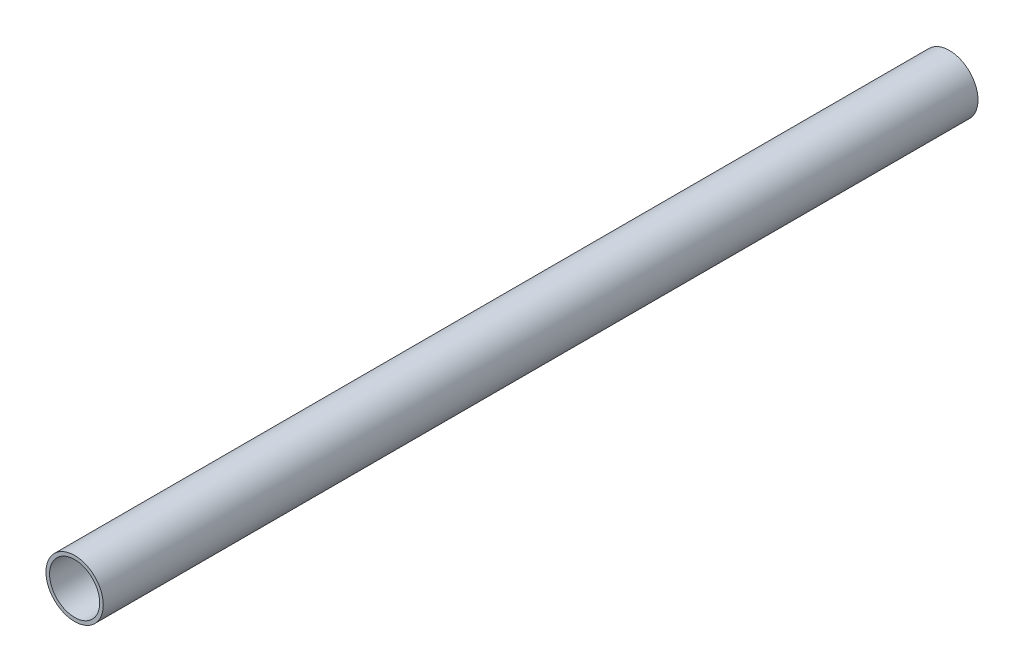
ISO-10303-21;
HEADER;
FILE_DESCRIPTION(('STEP AP214'),'2;1');
FILE_NAME('part.step','',(''),(''),'','','');
FILE_SCHEMA(('AUTOMOTIVE_DESIGN { 1 0 10303 214 1 1 1 1 }'));
ENDSEC;
DATA;
#1=APPLICATION_CONTEXT('core data for automotive mechanical design processes');
#2=APPLICATION_PROTOCOL_DEFINITION('international standard','automotive_design',2000,#1);
#3=PRODUCT_CONTEXT('',#1,'mechanical');
#4=PRODUCT('Part','Part','',(#3));
#5=PRODUCT_RELATED_PRODUCT_CATEGORY('part','',(#4));
#6=PRODUCT_DEFINITION_FORMATION('','',#4);
#7=PRODUCT_DEFINITION_CONTEXT('part definition',#1,'design');
#8=PRODUCT_DEFINITION('design','',#6,#7);
#9=PRODUCT_DEFINITION_SHAPE('','',#8);
#10=(LENGTH_UNIT() NAMED_UNIT(*) SI_UNIT(.MILLI.,.METRE.));
#11=(NAMED_UNIT(*) PLANE_ANGLE_UNIT() SI_UNIT($,.RADIAN.));
#12=(NAMED_UNIT(*) SI_UNIT($,.STERADIAN.) SOLID_ANGLE_UNIT());
#13=UNCERTAINTY_MEASURE_WITH_UNIT(LENGTH_MEASURE(1.E-05),#10,'distance_accuracy_value','');
#14=(GEOMETRIC_REPRESENTATION_CONTEXT(3) GLOBAL_UNCERTAINTY_ASSIGNED_CONTEXT((#13)) GLOBAL_UNIT_ASSIGNED_CONTEXT((#10,
#11,#12)) REPRESENTATION_CONTEXT('',''));
#15=CARTESIAN_POINT('',(0.,0.,0.));
#16=DIRECTION('',(0.,0.,1.));
#17=DIRECTION('',(1.,0.,0.));
#18=AXIS2_PLACEMENT_3D('',#15,#16,#17);
#19=CARTESIAN_POINT('',(0.,0.,387.62));
#20=DIRECTION('',(0.,0.,1.));
#21=DIRECTION('',(1.,0.,0.));
#22=AXIS2_PLACEMENT_3D('',#19,#20,#21);
#23=PLANE('',#22);
#24=CARTESIAN_POINT('',(0.,0.,387.62));
#25=DIRECTION('',(0.,0.,1.));
#26=DIRECTION('',(1.,0.,0.));
#27=AXIS2_PLACEMENT_3D('',#24,#25,#26);
#28=CIRCLE('',#27,12.7);
#29=CARTESIAN_POINT('',(12.7,0.,387.62));
#30=VERTEX_POINT('',#29);
#31=EDGE_CURVE('E10',#30,#30,#28,.T.);
#32=ORIENTED_EDGE('',*,*,#31,.T.);
#33=EDGE_LOOP('',(#32));
#34=FACE_BOUND('',#33,.T.);
#35=CARTESIAN_POINT('',(0.,0.,387.62));
#36=DIRECTION('',(0.,0.,1.));
#37=DIRECTION('',(1.,0.,0.));
#38=AXIS2_PLACEMENT_3D('',#35,#36,#37);
#39=CIRCLE('',#38,11.1125);
#40=CARTESIAN_POINT('',(11.1125,0.,387.62));
#41=VERTEX_POINT('',#40);
#42=EDGE_CURVE('E44',#41,#41,#39,.T.);
#43=ORIENTED_EDGE('',*,*,#42,.F.);
#44=EDGE_LOOP('',(#43));
#45=FACE_BOUND('',#44,.T.);
#46=ADVANCED_FACE('F33',(#34,#45),#23,.T.);
#47=CARTESIAN_POINT('',(0.,0.,0.));
#48=DIRECTION('',(0.,0.,1.));
#49=DIRECTION('',(1.,0.,0.));
#50=AXIS2_PLACEMENT_3D('',#47,#48,#49);
#51=PLANE('',#50);
#52=CARTESIAN_POINT('',(0.,0.,0.));
#53=DIRECTION('',(0.,0.,1.));
#54=DIRECTION('',(1.,0.,0.));
#55=AXIS2_PLACEMENT_3D('',#52,#53,#54);
#56=CIRCLE('',#55,12.7);
#57=CARTESIAN_POINT('',(12.7,0.,0.));
#58=VERTEX_POINT('',#57);
#59=EDGE_CURVE('E37',#58,#58,#56,.T.);
#60=ORIENTED_EDGE('',*,*,#59,.F.);
#61=EDGE_LOOP('',(#60));
#62=FACE_BOUND('',#61,.T.);
#63=CARTESIAN_POINT('',(0.,0.,0.));
#64=DIRECTION('',(0.,0.,1.));
#65=DIRECTION('',(1.,0.,0.));
#66=AXIS2_PLACEMENT_3D('',#63,#64,#65);
#67=CIRCLE('',#66,11.1125);
#68=CARTESIAN_POINT('',(11.1125,0.,0.));
#69=VERTEX_POINT('',#68);
#70=EDGE_CURVE('E46',#69,#69,#67,.T.);
#71=ORIENTED_EDGE('',*,*,#70,.T.);
#72=EDGE_LOOP('',(#71));
#73=FACE_BOUND('',#72,.T.);
#74=ADVANCED_FACE('F56',(#62,#73),#51,.F.);
#75=CARTESIAN_POINT('',(0.,0.,387.62));
#76=DIRECTION('',(0.,0.,-1.));
#77=DIRECTION('',(-1.,0.,0.));
#78=AXIS2_PLACEMENT_3D('',#75,#76,#77);
#79=CYLINDRICAL_SURFACE('',#78,12.7);
#80=ORIENTED_EDGE('',*,*,#31,.F.);
#81=EDGE_LOOP('',(#80));
#82=FACE_BOUND('',#81,.T.);
#83=ORIENTED_EDGE('',*,*,#59,.T.);
#84=EDGE_LOOP('',(#83));
#85=FACE_BOUND('',#84,.T.);
#86=ADVANCED_FACE('F35',(#82,#85),#79,.T.);
#87=CARTESIAN_POINT('',(0.,0.,387.62));
#88=DIRECTION('',(0.,0.,-1.));
#89=DIRECTION('',(-1.,0.,0.));
#90=AXIS2_PLACEMENT_3D('',#87,#88,#89);
#91=CYLINDRICAL_SURFACE('',#90,11.1125);
#92=ORIENTED_EDGE('',*,*,#42,.T.);
#93=EDGE_LOOP('',(#92));
#94=FACE_BOUND('',#93,.T.);
#95=ORIENTED_EDGE('',*,*,#70,.F.);
#96=EDGE_LOOP('',(#95));
#97=FACE_BOUND('',#96,.T.);
#98=ADVANCED_FACE('F52',(#94,#97),#91,.F.);
#99=CLOSED_SHELL('',(#46,#74,#86,#98));
#100=MANIFOLD_SOLID_BREP('B2',#99);
#101=ADVANCED_BREP_SHAPE_REPRESENTATION('',(#18,#100),#14);
#102=SHAPE_DEFINITION_REPRESENTATION(#9,#101);
ENDSEC;
END-ISO-10303-21;
